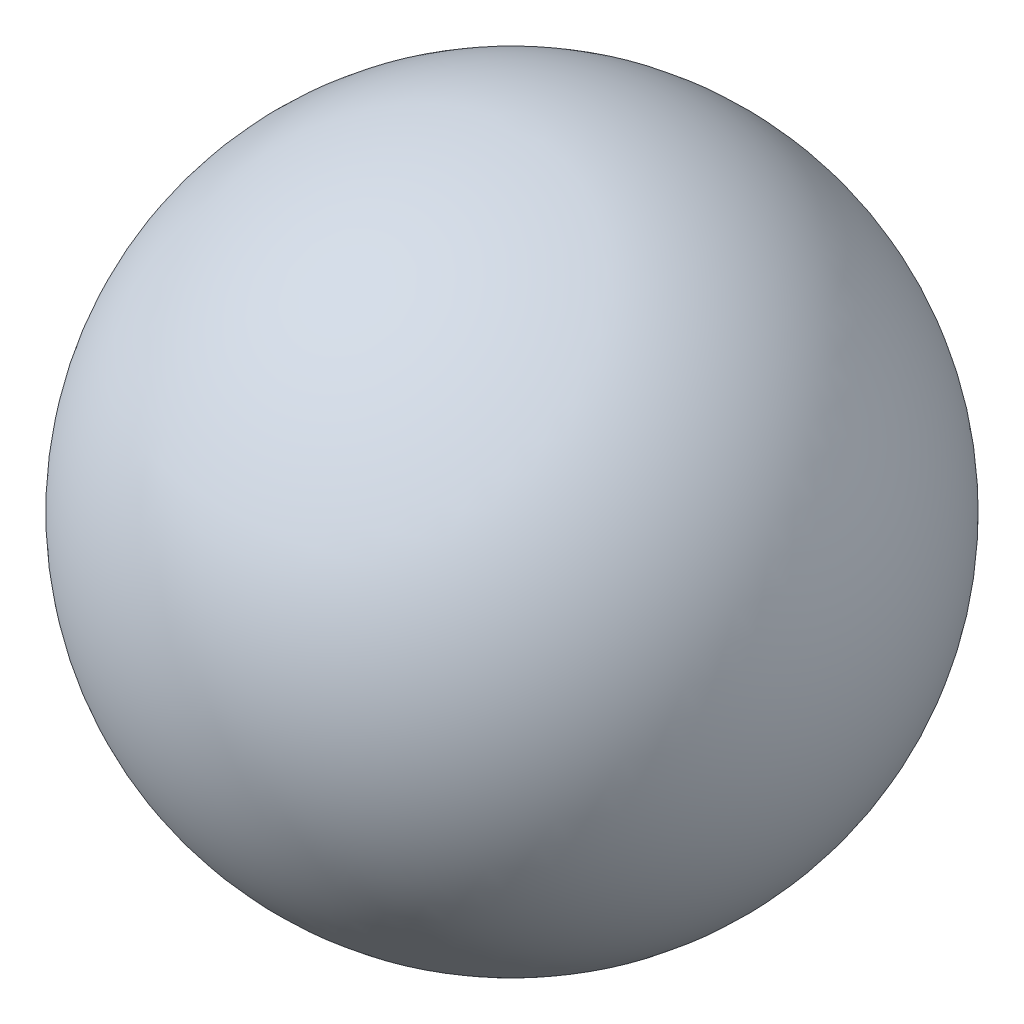
ISO-10303-21;
HEADER;
FILE_DESCRIPTION(('STEP AP214'),'2;1');
FILE_NAME('part.step','',(''),(''),'','','');
FILE_SCHEMA(('AUTOMOTIVE_DESIGN { 1 0 10303 214 1 1 1 1 }'));
ENDSEC;
DATA;
#1=APPLICATION_CONTEXT('core data for automotive mechanical design processes');
#2=APPLICATION_PROTOCOL_DEFINITION('international standard','automotive_design',2000,#1);
#3=PRODUCT_CONTEXT('',#1,'mechanical');
#4=PRODUCT('Part','Part','',(#3));
#5=PRODUCT_RELATED_PRODUCT_CATEGORY('part','',(#4));
#6=PRODUCT_DEFINITION_FORMATION('','',#4);
#7=PRODUCT_DEFINITION_CONTEXT('part definition',#1,'design');
#8=PRODUCT_DEFINITION('design','',#6,#7);
#9=PRODUCT_DEFINITION_SHAPE('','',#8);
#10=(LENGTH_UNIT() NAMED_UNIT(*) SI_UNIT(.MILLI.,.METRE.));
#11=(NAMED_UNIT(*) PLANE_ANGLE_UNIT() SI_UNIT($,.RADIAN.));
#12=(NAMED_UNIT(*) SI_UNIT($,.STERADIAN.) SOLID_ANGLE_UNIT());
#13=UNCERTAINTY_MEASURE_WITH_UNIT(LENGTH_MEASURE(1.E-05),#10,'distance_accuracy_value','');
#14=(GEOMETRIC_REPRESENTATION_CONTEXT(3) GLOBAL_UNCERTAINTY_ASSIGNED_CONTEXT((#13)) GLOBAL_UNIT_ASSIGNED_CONTEXT((#10,
#11,#12)) REPRESENTATION_CONTEXT('',''));
#15=CARTESIAN_POINT('',(0.,0.,0.));
#16=DIRECTION('',(0.,0.,1.));
#17=DIRECTION('',(1.,0.,0.));
#18=AXIS2_PLACEMENT_3D('',#15,#16,#17);
#19=CARTESIAN_POINT('',(0.,0.,0.));
#20=DIRECTION('',(0.,-1.,0.));
#21=DIRECTION('',(-1.,0.,0.));
#22=AXIS2_PLACEMENT_3D('',#19,#20,#21);
#23=SPHERICAL_SURFACE('',#22,63.5);
#24=CARTESIAN_POINT('',(0.,-63.5,0.));
#25=VERTEX_POINT('',#24);
#26=VERTEX_LOOP('',#25);
#27=FACE_BOUND('',#26,.T.);
#28=ADVANCED_FACE('F32',(#27),#23,.T.);
#29=CLOSED_SHELL('',(#28));
#30=CARTESIAN_POINT('',(0.,0.,0.));
#31=DIRECTION('',(0.,-1.,0.));
#32=DIRECTION('',(-1.,0.,0.));
#33=AXIS2_PLACEMENT_3D('',#30,#31,#32);
#34=SPHERICAL_SURFACE('',#33,38.1);
#35=CARTESIAN_POINT('',(0.,-38.1,0.));
#36=VERTEX_POINT('',#35);
#37=VERTEX_LOOP('',#36);
#38=FACE_BOUND('',#37,.T.);
#39=ADVANCED_FACE('F45',(#38),#34,.F.);
#40=CLOSED_SHELL('',(#39));
#41=ORIENTED_CLOSED_SHELL('',*,#40,.T.);
#42=BREP_WITH_VOIDS('B2',#29,(#41));
#43=ADVANCED_BREP_SHAPE_REPRESENTATION('',(#18,#42),#14);
#44=SHAPE_DEFINITION_REPRESENTATION(#9,#43);
ENDSEC;
END-ISO-10303-21;
